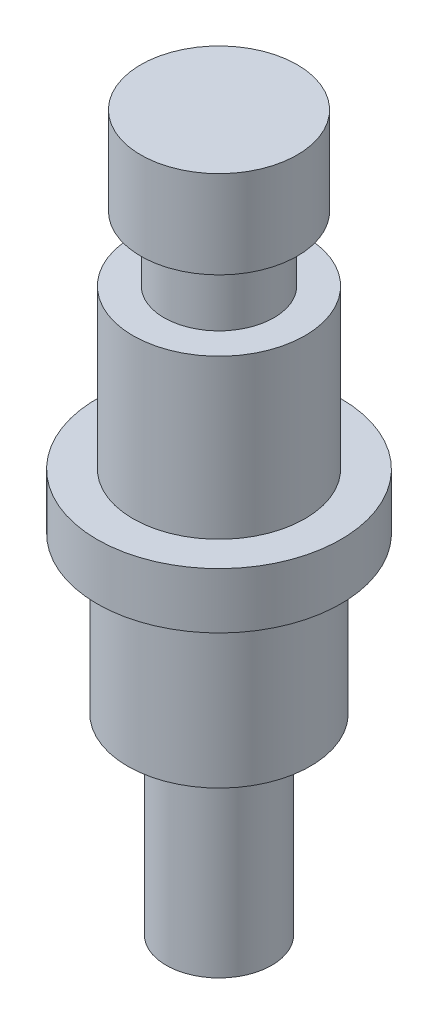
ISO-10303-21;
HEADER;
FILE_DESCRIPTION(('STEP AP214'),'2;1');
FILE_NAME('part.step','',(''),(''),'','','');
FILE_SCHEMA(('AUTOMOTIVE_DESIGN { 1 0 10303 214 1 1 1 1 }'));
ENDSEC;
DATA;
#1=APPLICATION_CONTEXT('core data for automotive mechanical design processes');
#2=APPLICATION_PROTOCOL_DEFINITION('international standard','automotive_design',2000,#1);
#3=PRODUCT_CONTEXT('',#1,'mechanical');
#4=PRODUCT('Part','Part','',(#3));
#5=PRODUCT_RELATED_PRODUCT_CATEGORY('part','',(#4));
#6=PRODUCT_DEFINITION_FORMATION('','',#4);
#7=PRODUCT_DEFINITION_CONTEXT('part definition',#1,'design');
#8=PRODUCT_DEFINITION('design','',#6,#7);
#9=PRODUCT_DEFINITION_SHAPE('','',#8);
#10=(LENGTH_UNIT() NAMED_UNIT(*) SI_UNIT(.MILLI.,.METRE.));
#11=(NAMED_UNIT(*) PLANE_ANGLE_UNIT() SI_UNIT($,.RADIAN.));
#12=(NAMED_UNIT(*) SI_UNIT($,.STERADIAN.) SOLID_ANGLE_UNIT());
#13=UNCERTAINTY_MEASURE_WITH_UNIT(LENGTH_MEASURE(1.E-05),#10,'distance_accuracy_value','');
#14=(GEOMETRIC_REPRESENTATION_CONTEXT(3) GLOBAL_UNCERTAINTY_ASSIGNED_CONTEXT((#13)) GLOBAL_UNIT_ASSIGNED_CONTEXT((#10,
#11,#12)) REPRESENTATION_CONTEXT('',''));
#15=CARTESIAN_POINT('',(0.,0.,0.));
#16=DIRECTION('',(0.,0.,1.));
#17=DIRECTION('',(1.,0.,0.));
#18=AXIS2_PLACEMENT_3D('',#15,#16,#17);
#19=CARTESIAN_POINT('',(0.,2.18,0.));
#20=DIRECTION('',(0.,-1.,0.));
#21=DIRECTION('',(0.,0.,-1.));
#22=AXIS2_PLACEMENT_3D('',#19,#20,#21);
#23=CYLINDRICAL_SURFACE('',#22,4.77);
#24=CARTESIAN_POINT('',(0.,2.18,0.));
#25=DIRECTION('',(0.,1.,0.));
#26=DIRECTION('',(0.,0.,1.));
#27=AXIS2_PLACEMENT_3D('',#24,#25,#26);
#28=CIRCLE('',#27,4.77);
#29=CARTESIAN_POINT('',(0.,2.18,4.77));
#30=VERTEX_POINT('',#29);
#31=EDGE_CURVE('E39',#30,#30,#28,.T.);
#32=ORIENTED_EDGE('',*,*,#31,.F.);
#33=EDGE_LOOP('',(#32));
#34=FACE_BOUND('',#33,.T.);
#35=CARTESIAN_POINT('',(0.,0.,0.));
#36=DIRECTION('',(0.,1.,0.));
#37=DIRECTION('',(0.,0.,1.));
#38=AXIS2_PLACEMENT_3D('',#35,#36,#37);
#39=CIRCLE('',#38,4.77);
#40=CARTESIAN_POINT('',(0.,0.,4.77));
#41=VERTEX_POINT('',#40);
#42=EDGE_CURVE('E43',#41,#41,#39,.T.);
#43=ORIENTED_EDGE('',*,*,#42,.T.);
#44=EDGE_LOOP('',(#43));
#45=FACE_BOUND('',#44,.T.);
#46=ADVANCED_FACE('F33',(#34,#45),#23,.T.);
#47=CARTESIAN_POINT('',(0.,2.18,0.));
#48=DIRECTION('',(0.,1.,0.));
#49=DIRECTION('',(0.,0.,1.));
#50=AXIS2_PLACEMENT_3D('',#47,#48,#49);
#51=PLANE('',#50);
#52=CARTESIAN_POINT('',(0.,2.18,0.));
#53=DIRECTION('',(0.,1.,0.));
#54=DIRECTION('',(0.,0.,1.));
#55=AXIS2_PLACEMENT_3D('',#52,#53,#54);
#56=CIRCLE('',#55,3.365);
#57=CARTESIAN_POINT('',(0.,2.18,-3.365));
#58=VERTEX_POINT('',#57);
#59=EDGE_CURVE('E59',#58,#58,#56,.T.);
#60=ORIENTED_EDGE('',*,*,#59,.F.);
#61=EDGE_LOOP('',(#60));
#62=FACE_BOUND('',#61,.T.);
#63=ORIENTED_EDGE('',*,*,#31,.T.);
#64=EDGE_LOOP('',(#63));
#65=FACE_BOUND('',#64,.T.);
#66=ADVANCED_FACE('F95',(#62,#65),#51,.T.);
#67=CARTESIAN_POINT('',(0.,0.,0.));
#68=DIRECTION('',(0.,1.,0.));
#69=DIRECTION('',(0.,0.,1.));
#70=AXIS2_PLACEMENT_3D('',#67,#68,#69);
#71=PLANE('',#70);
#72=CARTESIAN_POINT('',(0.,0.,0.));
#73=DIRECTION('',(0.,1.,0.));
#74=DIRECTION('',(0.,0.,1.));
#75=AXIS2_PLACEMENT_3D('',#72,#73,#74);
#76=CIRCLE('',#75,3.575);
#77=CARTESIAN_POINT('',(0.,0.,3.575));
#78=VERTEX_POINT('',#77);
#79=EDGE_CURVE('E10',#78,#78,#76,.F.);
#80=ORIENTED_EDGE('',*,*,#79,.F.);
#81=EDGE_LOOP('',(#80));
#82=FACE_BOUND('',#81,.T.);
#83=ORIENTED_EDGE('',*,*,#42,.F.);
#84=EDGE_LOOP('',(#83));
#85=FACE_BOUND('',#84,.T.);
#86=ADVANCED_FACE('F100',(#82,#85),#71,.F.);
#87=CARTESIAN_POINT('',(0.,-6.1,0.));
#88=DIRECTION('',(0.,1.,0.));
#89=DIRECTION('',(0.,0.,1.));
#90=AXIS2_PLACEMENT_3D('',#87,#88,#89);
#91=CYLINDRICAL_SURFACE('',#90,3.575);
#92=CARTESIAN_POINT('',(0.,-6.1,0.));
#93=DIRECTION('',(0.,-1.,0.));
#94=DIRECTION('',(0.,0.,-1.));
#95=AXIS2_PLACEMENT_3D('',#92,#93,#94);
#96=CIRCLE('',#95,3.575);
#97=CARTESIAN_POINT('',(0.,-6.1,-3.575));
#98=VERTEX_POINT('',#97);
#99=EDGE_CURVE('E48',#98,#98,#96,.T.);
#100=ORIENTED_EDGE('',*,*,#99,.F.);
#101=EDGE_LOOP('',(#100));
#102=FACE_BOUND('',#101,.T.);
#103=ORIENTED_EDGE('',*,*,#79,.T.);
#104=EDGE_LOOP('',(#103));
#105=FACE_BOUND('',#104,.T.);
#106=ADVANCED_FACE('F107',(#102,#105),#91,.T.);
#107=CARTESIAN_POINT('',(0.,-6.1,0.));
#108=DIRECTION('',(0.,-1.,0.));
#109=DIRECTION('',(0.,0.,-1.));
#110=AXIS2_PLACEMENT_3D('',#107,#108,#109);
#111=PLANE('',#110);
#112=CARTESIAN_POINT('',(0.,-6.1,0.));
#113=DIRECTION('',(0.,-1.,0.));
#114=DIRECTION('',(0.,0.,-1.));
#115=AXIS2_PLACEMENT_3D('',#112,#113,#114);
#116=CIRCLE('',#115,2.065);
#117=CARTESIAN_POINT('',(0.,-6.1,-2.065));
#118=VERTEX_POINT('',#117);
#119=EDGE_CURVE('E53',#118,#118,#116,.T.);
#120=ORIENTED_EDGE('',*,*,#119,.F.);
#121=EDGE_LOOP('',(#120));
#122=FACE_BOUND('',#121,.T.);
#123=ORIENTED_EDGE('',*,*,#99,.T.);
#124=EDGE_LOOP('',(#123));
#125=FACE_BOUND('',#124,.T.);
#126=ADVANCED_FACE('F112',(#122,#125),#111,.T.);
#127=CARTESIAN_POINT('',(0.,-13.6,0.));
#128=DIRECTION('',(0.,1.,0.));
#129=DIRECTION('',(0.,0.,1.));
#130=AXIS2_PLACEMENT_3D('',#127,#128,#129);
#131=CYLINDRICAL_SURFACE('',#130,2.065);
#132=CARTESIAN_POINT('',(0.,-13.6,0.));
#133=DIRECTION('',(0.,-1.,0.));
#134=DIRECTION('',(0.,0.,-1.));
#135=AXIS2_PLACEMENT_3D('',#132,#133,#134);
#136=CIRCLE('',#135,2.065);
#137=CARTESIAN_POINT('',(0.,-13.6,-2.065));
#138=VERTEX_POINT('',#137);
#139=EDGE_CURVE('E52',#138,#138,#136,.T.);
#140=ORIENTED_EDGE('',*,*,#139,.F.);
#141=EDGE_LOOP('',(#140));
#142=FACE_BOUND('',#141,.T.);
#143=ORIENTED_EDGE('',*,*,#119,.T.);
#144=EDGE_LOOP('',(#143));
#145=FACE_BOUND('',#144,.T.);
#146=ADVANCED_FACE('F118',(#142,#145),#131,.T.);
#147=CARTESIAN_POINT('',(0.,-13.6,0.));
#148=DIRECTION('',(0.,-1.,0.));
#149=DIRECTION('',(0.,0.,-1.));
#150=AXIS2_PLACEMENT_3D('',#147,#148,#149);
#151=PLANE('',#150);
#152=ORIENTED_EDGE('',*,*,#139,.T.);
#153=EDGE_LOOP('',(#152));
#154=FACE_BOUND('',#153,.T.);
#155=ADVANCED_FACE('F122',(#154),#151,.T.);
#156=CARTESIAN_POINT('',(0.,8.38,0.));
#157=DIRECTION('',(0.,-1.,0.));
#158=DIRECTION('',(0.,0.,-1.));
#159=AXIS2_PLACEMENT_3D('',#156,#157,#158);
#160=CYLINDRICAL_SURFACE('',#159,3.365);
#161=CARTESIAN_POINT('',(0.,8.38,0.));
#162=DIRECTION('',(0.,1.,0.));
#163=DIRECTION('',(0.,0.,1.));
#164=AXIS2_PLACEMENT_3D('',#161,#162,#163);
#165=CIRCLE('',#164,3.365);
#166=CARTESIAN_POINT('',(0.,8.38,-3.365));
#167=VERTEX_POINT('',#166);
#168=EDGE_CURVE('E56',#167,#167,#165,.T.);
#169=CARTESIAN_POINT('',(0.,8.38,-3.365));
#170=CARTESIAN_POINT('',(0.,8.31541666666667,-3.365));
#171=CARTESIAN_POINT('',(0.,8.25083333333333,-3.365));
#172=CARTESIAN_POINT('',(0.,8.12166666666667,-3.365));
#173=CARTESIAN_POINT('',(0.,8.05708333333333,-3.365));
#174=CARTESIAN_POINT('',(0.,7.92791666666667,-3.365));
#175=CARTESIAN_POINT('',(0.,7.86333333333333,-3.365));
#176=CARTESIAN_POINT('',(0.,7.73416666666667,-3.365));
#177=CARTESIAN_POINT('',(0.,7.66958333333333,-3.365));
#178=CARTESIAN_POINT('',(0.,7.54041666666667,-3.365));
#179=CARTESIAN_POINT('',(0.,7.47583333333333,-3.365));
#180=CARTESIAN_POINT('',(0.,7.34666666666667,-3.365));
#181=CARTESIAN_POINT('',(0.,7.28208333333333,-3.365));
#182=CARTESIAN_POINT('',(0.,7.15291666666667,-3.365));
#183=CARTESIAN_POINT('',(0.,7.08833333333333,-3.365));
#184=CARTESIAN_POINT('',(0.,6.95916666666667,-3.365));
#185=CARTESIAN_POINT('',(0.,6.89458333333333,-3.365));
#186=CARTESIAN_POINT('',(0.,6.76541666666667,-3.365));
#187=CARTESIAN_POINT('',(0.,6.70083333333333,-3.365));
#188=CARTESIAN_POINT('',(0.,6.57166666666667,-3.365));
#189=CARTESIAN_POINT('',(0.,6.50708333333333,-3.365));
#190=CARTESIAN_POINT('',(0.,6.37791666666667,-3.365));
#191=CARTESIAN_POINT('',(0.,6.31333333333333,-3.365));
#192=CARTESIAN_POINT('',(0.,6.18416666666667,-3.365));
#193=CARTESIAN_POINT('',(0.,6.11958333333333,-3.365));
#194=CARTESIAN_POINT('',(0.,5.99041666666667,-3.365));
#195=CARTESIAN_POINT('',(0.,5.92583333333333,-3.365));
#196=CARTESIAN_POINT('',(0.,5.79666666666667,-3.365));
#197=CARTESIAN_POINT('',(0.,5.73208333333333,-3.365));
#198=CARTESIAN_POINT('',(0.,5.60291666666667,-3.365));
#199=CARTESIAN_POINT('',(0.,5.53833333333333,-3.365));
#200=CARTESIAN_POINT('',(0.,5.40916666666667,-3.365));
#201=CARTESIAN_POINT('',(0.,5.34458333333333,-3.365));
#202=CARTESIAN_POINT('',(0.,5.21541666666667,-3.365));
#203=CARTESIAN_POINT('',(0.,5.15083333333333,-3.365));
#204=CARTESIAN_POINT('',(0.,5.02166666666667,-3.365));
#205=CARTESIAN_POINT('',(0.,4.95708333333333,-3.365));
#206=CARTESIAN_POINT('',(0.,4.82791666666667,-3.365));
#207=CARTESIAN_POINT('',(0.,4.76333333333333,-3.365));
#208=CARTESIAN_POINT('',(0.,4.63416666666667,-3.365));
#209=CARTESIAN_POINT('',(0.,4.56958333333333,-3.365));
#210=CARTESIAN_POINT('',(0.,4.44041666666667,-3.365));
#211=CARTESIAN_POINT('',(0.,4.37583333333333,-3.365));
#212=CARTESIAN_POINT('',(0.,4.24666666666667,-3.365));
#213=CARTESIAN_POINT('',(0.,4.18208333333333,-3.365));
#214=CARTESIAN_POINT('',(0.,4.05291666666667,-3.365));
#215=CARTESIAN_POINT('',(0.,3.98833333333333,-3.365));
#216=CARTESIAN_POINT('',(0.,3.85916666666667,-3.365));
#217=CARTESIAN_POINT('',(0.,3.79458333333333,-3.365));
#218=CARTESIAN_POINT('',(0.,3.66541666666667,-3.365));
#219=CARTESIAN_POINT('',(0.,3.60083333333333,-3.365));
#220=CARTESIAN_POINT('',(0.,3.47166666666667,-3.365));
#221=CARTESIAN_POINT('',(0.,3.40708333333333,-3.365));
#222=CARTESIAN_POINT('',(0.,3.27791666666667,-3.365));
#223=CARTESIAN_POINT('',(0.,3.21333333333333,-3.365));
#224=CARTESIAN_POINT('',(0.,3.08416666666667,-3.365));
#225=CARTESIAN_POINT('',(0.,3.01958333333333,-3.365));
#226=CARTESIAN_POINT('',(0.,2.89041666666667,-3.365));
#227=CARTESIAN_POINT('',(0.,2.82583333333333,-3.365));
#228=CARTESIAN_POINT('',(0.,2.69666666666667,-3.365));
#229=CARTESIAN_POINT('',(0.,2.63208333333333,-3.365));
#230=CARTESIAN_POINT('',(0.,2.50291666666667,-3.365));
#231=CARTESIAN_POINT('',(0.,2.43833333333333,-3.365));
#232=CARTESIAN_POINT('',(0.,2.30916666666667,-3.365));
#233=CARTESIAN_POINT('',(0.,2.24458333333333,-3.365));
#234=CARTESIAN_POINT('',(0.,2.18,-3.365));
#235=B_SPLINE_CURVE_WITH_KNOTS('',3,(#169,#170,#171,#172,#173,#174,#175,#176,#177,#178,#179,
#180,#181,#182,#183,#184,#185,#186,#187,#188,#189,#190,#191,#192,#193,#194,#195,#196,#197,#198,
#199,#200,#201,#202,#203,#204,#205,#206,#207,#208,#209,#210,#211,#212,#213,#214,#215,#216,#217,
#218,#219,#220,#221,#222,#223,#224,#225,#226,#227,#228,#229,#230,#231,#232,#233,#234),
.UNSPECIFIED.,.F.,.F.,(4,2,2,2,2,2,2,2,2,2,2,2,2,2,2,2,2,2,2,2,2,2,2,2,2,2,2,2,2,2,2,2,4),(0.,
0.193750000000001,0.387500000000001,0.581250000000001,0.775,0.968750000000001,1.1625,1.35625,
1.55,1.74375,1.9375,2.13125,2.325,2.51875,2.7125,2.90625,3.1,3.29375,3.4875,3.68125,3.875,
4.06875,4.2625,4.45625,4.65,4.84375,5.0375,5.23125,5.425,5.61875,5.8125,6.00625,6.2),.UNSPECIFIED.);
#236=EDGE_CURVE('BSEAM126',#167,#58,#235,.T.);
#237=ORIENTED_EDGE('',*,*,#168,.F.);
#238=ORIENTED_EDGE('',*,*,#59,.T.);
#239=ORIENTED_EDGE('',*,*,#236,.T.);
#240=ORIENTED_EDGE('',*,*,#236,.F.);
#241=EDGE_LOOP('',(#237,#239,#238,#240));
#242=FACE_BOUND('',#241,.T.);
#243=ADVANCED_FACE('F126',(#242),#160,.T.);
#244=CARTESIAN_POINT('',(0.,8.38,0.));
#245=DIRECTION('',(0.,1.,0.));
#246=DIRECTION('',(0.,0.,1.));
#247=AXIS2_PLACEMENT_3D('',#244,#245,#246);
#248=PLANE('',#247);
#249=CARTESIAN_POINT('',(0.,8.38,0.));
#250=DIRECTION('',(0.,1.,0.));
#251=DIRECTION('',(0.,0.,1.));
#252=AXIS2_PLACEMENT_3D('',#249,#250,#251);
#253=CIRCLE('',#252,2.15);
#254=CARTESIAN_POINT('',(0.,8.38,2.15));
#255=VERTEX_POINT('',#254);
#256=EDGE_CURVE('E65',#255,#255,#253,.T.);
#257=ORIENTED_EDGE('',*,*,#256,.F.);
#258=EDGE_LOOP('',(#257));
#259=FACE_BOUND('',#258,.T.);
#260=ORIENTED_EDGE('',*,*,#168,.T.);
#261=EDGE_LOOP('',(#260));
#262=FACE_BOUND('',#261,.T.);
#263=ADVANCED_FACE('F130',(#259,#262),#248,.T.);
#264=CARTESIAN_POINT('',(0.,10.92,0.));
#265=DIRECTION('',(0.,-1.,0.));
#266=DIRECTION('',(0.,0.,-1.));
#267=AXIS2_PLACEMENT_3D('',#264,#265,#266);
#268=CYLINDRICAL_SURFACE('',#267,2.15);
#269=CARTESIAN_POINT('',(0.,10.92,0.));
#270=DIRECTION('',(0.,1.,0.));
#271=DIRECTION('',(0.,0.,1.));
#272=AXIS2_PLACEMENT_3D('',#269,#270,#271);
#273=CIRCLE('',#272,2.15);
#274=CARTESIAN_POINT('',(0.,10.92,2.15));
#275=VERTEX_POINT('',#274);
#276=EDGE_CURVE('E62',#275,#275,#273,.T.);
#277=ORIENTED_EDGE('',*,*,#276,.F.);
#278=EDGE_LOOP('',(#277));
#279=FACE_BOUND('',#278,.T.);
#280=ORIENTED_EDGE('',*,*,#256,.T.);
#281=EDGE_LOOP('',(#280));
#282=FACE_BOUND('',#281,.T.);
#283=ADVANCED_FACE('F82',(#279,#282),#268,.T.);
#284=CARTESIAN_POINT('',(0.,14.35,0.));
#285=DIRECTION('',(0.,-1.,0.));
#286=DIRECTION('',(0.,0.,-1.));
#287=AXIS2_PLACEMENT_3D('',#284,#285,#286);
#288=CYLINDRICAL_SURFACE('',#287,3.06);
#289=CARTESIAN_POINT('',(0.,14.35,0.));
#290=DIRECTION('',(0.,1.,0.));
#291=DIRECTION('',(0.,0.,1.));
#292=AXIS2_PLACEMENT_3D('',#289,#290,#291);
#293=CIRCLE('',#292,3.06);
#294=CARTESIAN_POINT('',(0.,14.35,-3.06));
#295=VERTEX_POINT('',#294);
#296=EDGE_CURVE('E68',#295,#295,#293,.T.);
#297=CARTESIAN_POINT('',(0.,10.92,0.));
#298=DIRECTION('',(0.,1.,0.));
#299=DIRECTION('',(0.,0.,1.));
#300=AXIS2_PLACEMENT_3D('',#297,#298,#299);
#301=CIRCLE('',#300,3.06);
#302=CARTESIAN_POINT('',(0.,10.92,-3.06));
#303=VERTEX_POINT('',#302);
#304=EDGE_CURVE('E71',#303,#303,#301,.T.);
#305=CARTESIAN_POINT('',(0.,14.35,-3.06));
#306=CARTESIAN_POINT('',(0.,14.3142708333333,-3.06));
#307=CARTESIAN_POINT('',(0.,14.2785416666667,-3.06));
#308=CARTESIAN_POINT('',(0.,14.2070833333333,-3.06));
#309=CARTESIAN_POINT('',(0.,14.1713541666667,-3.06));
#310=CARTESIAN_POINT('',(0.,14.0998958333333,-3.06));
#311=CARTESIAN_POINT('',(0.,14.0641666666667,-3.06));
#312=CARTESIAN_POINT('',(0.,13.9927083333333,-3.06));
#313=CARTESIAN_POINT('',(0.,13.9569791666667,-3.06));
#314=CARTESIAN_POINT('',(0.,13.8855208333333,-3.06));
#315=CARTESIAN_POINT('',(0.,13.8497916666667,-3.06));
#316=CARTESIAN_POINT('',(0.,13.7783333333333,-3.06));
#317=CARTESIAN_POINT('',(0.,13.7426041666667,-3.06));
#318=CARTESIAN_POINT('',(0.,13.6711458333333,-3.06));
#319=CARTESIAN_POINT('',(0.,13.6354166666667,-3.06));
#320=CARTESIAN_POINT('',(0.,13.5639583333333,-3.06));
#321=CARTESIAN_POINT('',(0.,13.5282291666667,-3.06));
#322=CARTESIAN_POINT('',(0.,13.4567708333333,-3.06));
#323=CARTESIAN_POINT('',(0.,13.4210416666667,-3.06));
#324=CARTESIAN_POINT('',(0.,13.3495833333333,-3.06));
#325=CARTESIAN_POINT('',(0.,13.3138541666667,-3.06));
#326=CARTESIAN_POINT('',(0.,13.2423958333333,-3.06));
#327=CARTESIAN_POINT('',(0.,13.2066666666667,-3.06));
#328=CARTESIAN_POINT('',(0.,13.1352083333333,-3.06));
#329=CARTESIAN_POINT('',(0.,13.0994791666667,-3.06));
#330=CARTESIAN_POINT('',(0.,13.0280208333333,-3.06));
#331=CARTESIAN_POINT('',(0.,12.9922916666667,-3.06));
#332=CARTESIAN_POINT('',(0.,12.9208333333333,-3.06));
#333=CARTESIAN_POINT('',(0.,12.8851041666667,-3.06));
#334=CARTESIAN_POINT('',(0.,12.8136458333333,-3.06));
#335=CARTESIAN_POINT('',(0.,12.7779166666667,-3.06));
#336=CARTESIAN_POINT('',(0.,12.7064583333333,-3.06));
#337=CARTESIAN_POINT('',(0.,12.6707291666667,-3.06));
#338=CARTESIAN_POINT('',(0.,12.5992708333333,-3.06));
#339=CARTESIAN_POINT('',(0.,12.5635416666667,-3.06));
#340=CARTESIAN_POINT('',(0.,12.4920833333333,-3.06));
#341=CARTESIAN_POINT('',(0.,12.4563541666667,-3.06));
#342=CARTESIAN_POINT('',(0.,12.3848958333333,-3.06));
#343=CARTESIAN_POINT('',(0.,12.3491666666667,-3.06));
#344=CARTESIAN_POINT('',(0.,12.2777083333333,-3.06));
#345=CARTESIAN_POINT('',(0.,12.2419791666667,-3.06));
#346=CARTESIAN_POINT('',(0.,12.1705208333333,-3.06));
#347=CARTESIAN_POINT('',(0.,12.1347916666667,-3.06));
#348=CARTESIAN_POINT('',(0.,12.0633333333333,-3.06));
#349=CARTESIAN_POINT('',(0.,12.0276041666667,-3.06));
#350=CARTESIAN_POINT('',(0.,11.9561458333333,-3.06));
#351=CARTESIAN_POINT('',(0.,11.9204166666667,-3.06));
#352=CARTESIAN_POINT('',(0.,11.8489583333333,-3.06));
#353=CARTESIAN_POINT('',(0.,11.8132291666667,-3.06));
#354=CARTESIAN_POINT('',(0.,11.7417708333333,-3.06));
#355=CARTESIAN_POINT('',(0.,11.7060416666667,-3.06));
#356=CARTESIAN_POINT('',(0.,11.6345833333333,-3.06));
#357=CARTESIAN_POINT('',(0.,11.5988541666667,-3.06));
#358=CARTESIAN_POINT('',(0.,11.5273958333333,-3.06));
#359=CARTESIAN_POINT('',(0.,11.4916666666667,-3.06));
#360=CARTESIAN_POINT('',(0.,11.4202083333333,-3.06));
#361=CARTESIAN_POINT('',(0.,11.3844791666667,-3.06));
#362=CARTESIAN_POINT('',(0.,11.3130208333333,-3.06));
#363=CARTESIAN_POINT('',(0.,11.2772916666667,-3.06));
#364=CARTESIAN_POINT('',(0.,11.2058333333333,-3.06));
#365=CARTESIAN_POINT('',(0.,11.1701041666667,-3.06));
#366=CARTESIAN_POINT('',(0.,11.0986458333333,-3.06));
#367=CARTESIAN_POINT('',(0.,11.0629166666667,-3.06));
#368=CARTESIAN_POINT('',(0.,10.9914583333333,-3.06));
#369=CARTESIAN_POINT('',(0.,10.9557291666667,-3.06));
#370=CARTESIAN_POINT('',(0.,10.92,-3.06));
#371=B_SPLINE_CURVE_WITH_KNOTS('',3,(#305,#306,#307,#308,#309,#310,#311,#312,#313,#314,#315,
#316,#317,#318,#319,#320,#321,#322,#323,#324,#325,#326,#327,#328,#329,#330,#331,#332,#333,#334,
#335,#336,#337,#338,#339,#340,#341,#342,#343,#344,#345,#346,#347,#348,#349,#350,#351,#352,#353,
#354,#355,#356,#357,#358,#359,#360,#361,#362,#363,#364,#365,#366,#367,#368,#369,#370),
.UNSPECIFIED.,.F.,.F.,(4,2,2,2,2,2,2,2,2,2,2,2,2,2,2,2,2,2,2,2,2,2,2,2,2,2,2,2,2,2,2,2,4),(0.,
0.107187500000001,0.214375000000001,0.321562500000001,0.42875,0.535937500000002,
0.643125000000001,0.750312500000001,0.857500000000001,0.9646875,1.071875,1.1790625,1.28625,
1.3934375,1.500625,1.6078125,1.715,1.8221875,1.929375,2.0365625,2.14375,2.2509375,2.358125,
2.4653125,2.5725,2.6796875,2.786875,2.8940625,3.00125,3.1084375,3.215625,3.3228125,3.43),.UNSPECIFIED.);
#372=EDGE_CURVE('BSEAM79',#295,#303,#371,.T.);
#373=ORIENTED_EDGE('',*,*,#296,.F.);
#374=ORIENTED_EDGE('',*,*,#304,.T.);
#375=ORIENTED_EDGE('',*,*,#372,.T.);
#376=ORIENTED_EDGE('',*,*,#372,.F.);
#377=EDGE_LOOP('',(#373,#375,#374,#376));
#378=FACE_BOUND('',#377,.T.);
#379=ADVANCED_FACE('F79',(#378),#288,.T.);
#380=CARTESIAN_POINT('',(0.,14.35,0.));
#381=DIRECTION('',(0.,1.,0.));
#382=DIRECTION('',(0.,0.,1.));
#383=AXIS2_PLACEMENT_3D('',#380,#381,#382);
#384=PLANE('',#383);
#385=ORIENTED_EDGE('',*,*,#296,.T.);
#386=EDGE_LOOP('',(#385));
#387=FACE_BOUND('',#386,.T.);
#388=ADVANCED_FACE('F77',(#387),#384,.T.);
#389=CARTESIAN_POINT('',(0.,10.92,0.));
#390=DIRECTION('',(0.,1.,0.));
#391=DIRECTION('',(0.,0.,1.));
#392=AXIS2_PLACEMENT_3D('',#389,#390,#391);
#393=PLANE('',#392);
#394=ORIENTED_EDGE('',*,*,#276,.T.);
#395=EDGE_LOOP('',(#394));
#396=FACE_BOUND('',#395,.T.);
#397=ORIENTED_EDGE('',*,*,#304,.F.);
#398=EDGE_LOOP('',(#397));
#399=FACE_BOUND('',#398,.T.);
#400=ADVANCED_FACE('F86',(#396,#399),#393,.F.);
#401=CLOSED_SHELL('',(#46,#66,#86,#106,#126,#146,#155,#243,#263,#283,#379,#388,#400));
#402=MANIFOLD_SOLID_BREP('B2',#401);
#403=ADVANCED_BREP_SHAPE_REPRESENTATION('',(#18,#402),#14);
#404=SHAPE_DEFINITION_REPRESENTATION(#9,#403);
ENDSEC;
END-ISO-10303-21;
